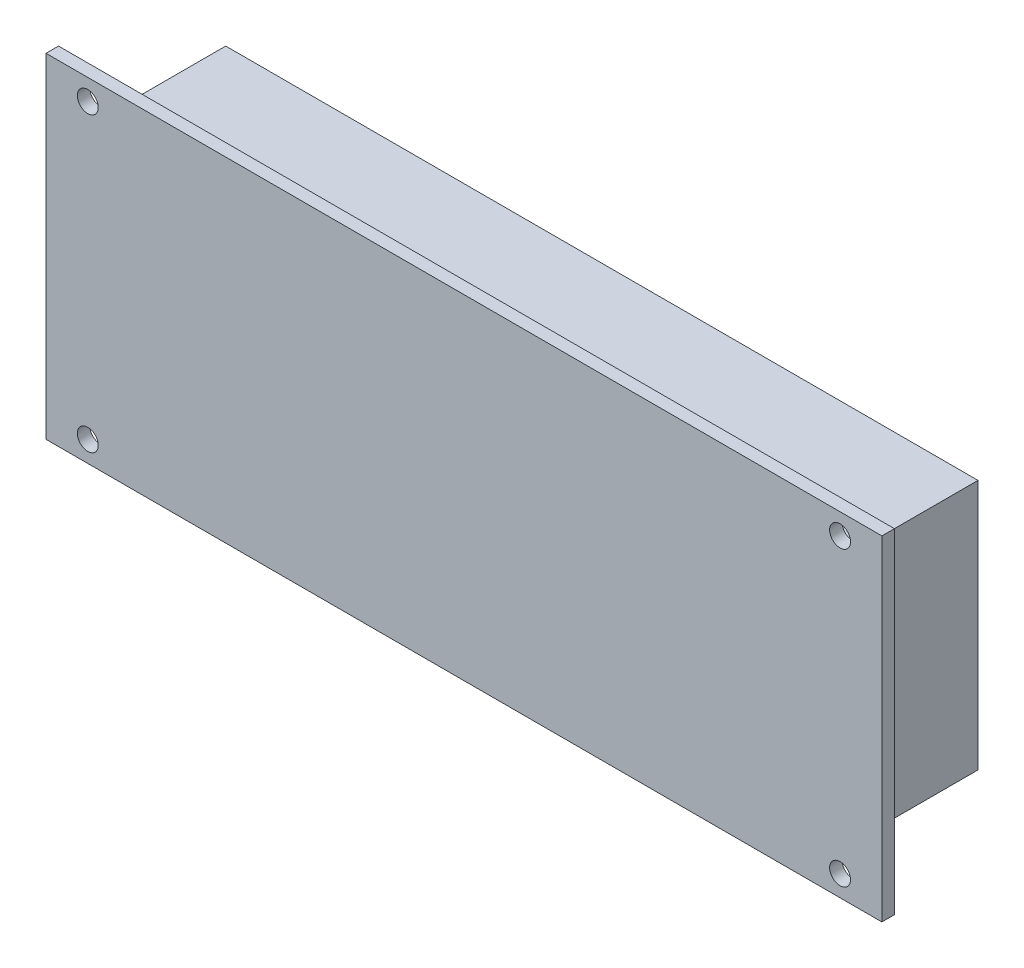
ISO-10303-21;
HEADER;
FILE_DESCRIPTION(('STEP AP214'),'2;1');
FILE_NAME('part.step','',(''),(''),'','','');
FILE_SCHEMA(('AUTOMOTIVE_DESIGN { 1 0 10303 214 1 1 1 1 }'));
ENDSEC;
DATA;
#1=APPLICATION_CONTEXT('core data for automotive mechanical design processes');
#2=APPLICATION_PROTOCOL_DEFINITION('international standard','automotive_design',2000,#1);
#3=PRODUCT_CONTEXT('',#1,'mechanical');
#4=PRODUCT('Part','Part','',(#3));
#5=PRODUCT_RELATED_PRODUCT_CATEGORY('part','',(#4));
#6=PRODUCT_DEFINITION_FORMATION('','',#4);
#7=PRODUCT_DEFINITION_CONTEXT('part definition',#1,'design');
#8=PRODUCT_DEFINITION('design','',#6,#7);
#9=PRODUCT_DEFINITION_SHAPE('','',#8);
#10=(LENGTH_UNIT() NAMED_UNIT(*) SI_UNIT(.MILLI.,.METRE.));
#11=(NAMED_UNIT(*) PLANE_ANGLE_UNIT() SI_UNIT($,.RADIAN.));
#12=(NAMED_UNIT(*) SI_UNIT($,.STERADIAN.) SOLID_ANGLE_UNIT());
#13=UNCERTAINTY_MEASURE_WITH_UNIT(LENGTH_MEASURE(1.E-05),#10,'distance_accuracy_value','');
#14=(GEOMETRIC_REPRESENTATION_CONTEXT(3) GLOBAL_UNCERTAINTY_ASSIGNED_CONTEXT((#13)) GLOBAL_UNIT_ASSIGNED_CONTEXT((#10,
#11,#12)) REPRESENTATION_CONTEXT('',''));
#15=CARTESIAN_POINT('',(0.,0.,0.));
#16=DIRECTION('',(0.,0.,1.));
#17=DIRECTION('',(1.,0.,0.));
#18=AXIS2_PLACEMENT_3D('',#15,#16,#17);
#19=CARTESIAN_POINT('',(100.,-40.,3.));
#20=DIRECTION('',(-1.,0.,0.));
#21=DIRECTION('',(0.,0.,1.));
#22=AXIS2_PLACEMENT_3D('',#19,#20,#21);
#23=PLANE('',#22);
#24=DIRECTION('',(0.,1.,0.));
#25=VECTOR('',#24,1.);
#26=CARTESIAN_POINT('',(100.,-40.,0.));
#27=LINE('',#26,#25);
#28=CARTESIAN_POINT('',(100.,-40.,0.));
#29=VERTEX_POINT('',#28);
#30=CARTESIAN_POINT('',(100.,40.,0.));
#31=VERTEX_POINT('',#30);
#32=EDGE_CURVE('E127',#29,#31,#27,.T.);
#33=ORIENTED_EDGE('',*,*,#32,.T.);
#34=DIRECTION('',(0.,0.,-1.));
#35=VECTOR('',#34,1.);
#36=CARTESIAN_POINT('',(100.,40.,3.));
#37=LINE('',#36,#35);
#38=CARTESIAN_POINT('',(100.,40.,3.));
#39=VERTEX_POINT('',#38);
#40=EDGE_CURVE('E11',#39,#31,#37,.T.);
#41=ORIENTED_EDGE('',*,*,#40,.F.);
#42=DIRECTION('',(0.,1.,0.));
#43=VECTOR('',#42,1.);
#44=CARTESIAN_POINT('',(100.,-40.,3.));
#45=LINE('',#44,#43);
#46=CARTESIAN_POINT('',(100.,-40.,3.));
#47=VERTEX_POINT('',#46);
#48=EDGE_CURVE('E136',#47,#39,#45,.T.);
#49=ORIENTED_EDGE('',*,*,#48,.F.);
#50=DIRECTION('',(0.,0.,-1.));
#51=VECTOR('',#50,1.);
#52=CARTESIAN_POINT('',(100.,-40.,3.));
#53=LINE('',#52,#51);
#54=EDGE_CURVE('E145',#47,#29,#53,.T.);
#55=ORIENTED_EDGE('',*,*,#54,.T.);
#56=EDGE_LOOP('',(#33,#41,#49,#55));
#57=FACE_BOUND('',#56,.T.);
#58=ADVANCED_FACE('F43',(#57),#23,.F.);
#59=CARTESIAN_POINT('',(-100.,40.,3.));
#60=DIRECTION('',(0.,-1.,0.));
#61=DIRECTION('',(0.,0.,-1.));
#62=AXIS2_PLACEMENT_3D('',#59,#60,#61);
#63=PLANE('',#62);
#64=DIRECTION('',(-1.,0.,0.));
#65=VECTOR('',#64,1.);
#66=CARTESIAN_POINT('',(-100.,40.,0.));
#67=LINE('',#66,#65);
#68=CARTESIAN_POINT('',(-100.,40.,0.));
#69=VERTEX_POINT('',#68);
#70=EDGE_CURVE('E130',#31,#69,#67,.T.);
#71=ORIENTED_EDGE('',*,*,#70,.T.);
#72=DIRECTION('',(0.,0.,-1.));
#73=VECTOR('',#72,1.);
#74=CARTESIAN_POINT('',(-100.,40.,3.));
#75=LINE('',#74,#73);
#76=CARTESIAN_POINT('',(-100.,40.,3.));
#77=VERTEX_POINT('',#76);
#78=EDGE_CURVE('E50',#77,#69,#75,.T.);
#79=ORIENTED_EDGE('',*,*,#78,.F.);
#80=DIRECTION('',(-1.,0.,0.));
#81=VECTOR('',#80,1.);
#82=CARTESIAN_POINT('',(-100.,40.,3.));
#83=LINE('',#82,#81);
#84=EDGE_CURVE('E139',#39,#77,#83,.T.);
#85=ORIENTED_EDGE('',*,*,#84,.F.);
#86=ORIENTED_EDGE('',*,*,#40,.T.);
#87=EDGE_LOOP('',(#71,#79,#85,#86));
#88=FACE_BOUND('',#87,.T.);
#89=ADVANCED_FACE('F176',(#88),#63,.F.);
#90=CARTESIAN_POINT('',(-100.,-40.,3.));
#91=DIRECTION('',(1.,0.,0.));
#92=DIRECTION('',(0.,0.,-1.));
#93=AXIS2_PLACEMENT_3D('',#90,#91,#92);
#94=PLANE('',#93);
#95=DIRECTION('',(0.,-1.,0.));
#96=VECTOR('',#95,1.);
#97=CARTESIAN_POINT('',(-100.,-40.,0.));
#98=LINE('',#97,#96);
#99=CARTESIAN_POINT('',(-100.,-40.,0.));
#100=VERTEX_POINT('',#99);
#101=EDGE_CURVE('E148',#69,#100,#98,.T.);
#102=ORIENTED_EDGE('',*,*,#101,.T.);
#103=DIRECTION('',(0.,0.,-1.));
#104=VECTOR('',#103,1.);
#105=CARTESIAN_POINT('',(-100.,-40.,3.));
#106=LINE('',#105,#104);
#107=CARTESIAN_POINT('',(-100.,-40.,3.));
#108=VERTEX_POINT('',#107);
#109=EDGE_CURVE('E153',#108,#100,#106,.T.);
#110=ORIENTED_EDGE('',*,*,#109,.F.);
#111=DIRECTION('',(0.,-1.,0.));
#112=VECTOR('',#111,1.);
#113=CARTESIAN_POINT('',(-100.,-40.,3.));
#114=LINE('',#113,#112);
#115=EDGE_CURVE('E142',#77,#108,#114,.T.);
#116=ORIENTED_EDGE('',*,*,#115,.F.);
#117=ORIENTED_EDGE('',*,*,#78,.T.);
#118=EDGE_LOOP('',(#102,#110,#116,#117));
#119=FACE_BOUND('',#118,.T.);
#120=ADVANCED_FACE('F160',(#119),#94,.F.);
#121=CARTESIAN_POINT('',(-100.,-40.,3.));
#122=DIRECTION('',(0.,1.,0.));
#123=DIRECTION('',(0.,0.,1.));
#124=AXIS2_PLACEMENT_3D('',#121,#122,#123);
#125=PLANE('',#124);
#126=DIRECTION('',(1.,0.,0.));
#127=VECTOR('',#126,1.);
#128=CARTESIAN_POINT('',(-100.,-40.,0.));
#129=LINE('',#128,#127);
#130=EDGE_CURVE('E140',#100,#29,#129,.T.);
#131=ORIENTED_EDGE('',*,*,#130,.T.);
#132=ORIENTED_EDGE('',*,*,#54,.F.);
#133=DIRECTION('',(1.,0.,0.));
#134=VECTOR('',#133,1.);
#135=CARTESIAN_POINT('',(-100.,-40.,3.));
#136=LINE('',#135,#134);
#137=EDGE_CURVE('E144',#108,#47,#136,.T.);
#138=ORIENTED_EDGE('',*,*,#137,.F.);
#139=ORIENTED_EDGE('',*,*,#109,.T.);
#140=EDGE_LOOP('',(#131,#132,#138,#139));
#141=FACE_BOUND('',#140,.T.);
#142=ADVANCED_FACE('F169',(#141),#125,.F.);
#143=CARTESIAN_POINT('',(0.,0.,3.));
#144=DIRECTION('',(0.,0.,-1.));
#145=DIRECTION('',(-1.,0.,0.));
#146=AXIS2_PLACEMENT_3D('',#143,#144,#145);
#147=PLANE('',#146);
#148=CARTESIAN_POINT('',(90.,35.,3.));
#149=DIRECTION('',(0.,0.,-1.));
#150=DIRECTION('',(-1.,0.,0.));
#151=AXIS2_PLACEMENT_3D('',#148,#149,#150);
#152=CIRCLE('',#151,2.49999999999999);
#153=CARTESIAN_POINT('',(87.5,35.,3.));
#154=VERTEX_POINT('',#153);
#155=EDGE_CURVE('E229',#154,#154,#152,.T.);
#156=ORIENTED_EDGE('',*,*,#155,.T.);
#157=EDGE_LOOP('',(#156));
#158=FACE_BOUND('',#157,.T.);
#159=CARTESIAN_POINT('',(89.9999999999998,-35.,3.));
#160=DIRECTION('',(0.,0.,-1.));
#161=DIRECTION('',(-1.,0.,0.));
#162=AXIS2_PLACEMENT_3D('',#159,#160,#161);
#163=CIRCLE('',#162,2.49999999999999);
#164=CARTESIAN_POINT('',(87.4999999999998,-35.,3.));
#165=VERTEX_POINT('',#164);
#166=EDGE_CURVE('E233',#165,#165,#163,.T.);
#167=ORIENTED_EDGE('',*,*,#166,.T.);
#168=EDGE_LOOP('',(#167));
#169=FACE_BOUND('',#168,.T.);
#170=CARTESIAN_POINT('',(-89.9999999999991,-35.0000000000009,3.));
#171=DIRECTION('',(0.,0.,-1.));
#172=DIRECTION('',(-1.,0.,0.));
#173=AXIS2_PLACEMENT_3D('',#170,#171,#172);
#174=CIRCLE('',#173,2.49999999999999);
#175=CARTESIAN_POINT('',(-92.4999999999991,-35.0000000000009,3.));
#176=VERTEX_POINT('',#175);
#177=EDGE_CURVE('E242',#176,#176,#174,.T.);
#178=ORIENTED_EDGE('',*,*,#177,.T.);
#179=EDGE_LOOP('',(#178));
#180=FACE_BOUND('',#179,.T.);
#181=CARTESIAN_POINT('',(-90.,34.9999999999991,3.));
#182=DIRECTION('',(0.,0.,-1.));
#183=DIRECTION('',(-1.,0.,0.));
#184=AXIS2_PLACEMENT_3D('',#181,#182,#183);
#185=CIRCLE('',#184,2.49999999999999);
#186=CARTESIAN_POINT('',(-92.5,34.9999999999991,3.));
#187=VERTEX_POINT('',#186);
#188=EDGE_CURVE('E248',#187,#187,#185,.T.);
#189=ORIENTED_EDGE('',*,*,#188,.T.);
#190=EDGE_LOOP('',(#189));
#191=FACE_BOUND('',#190,.T.);
#192=ORIENTED_EDGE('',*,*,#48,.T.);
#193=ORIENTED_EDGE('',*,*,#84,.T.);
#194=ORIENTED_EDGE('',*,*,#115,.T.);
#195=ORIENTED_EDGE('',*,*,#137,.T.);
#196=EDGE_LOOP('',(#192,#193,#194,#195));
#197=FACE_BOUND('',#196,.T.);
#198=ADVANCED_FACE('F175',(#158,#169,#180,#191,#197),#147,.F.);
#199=CARTESIAN_POINT('',(0.,0.,0.));
#200=DIRECTION('',(0.,0.,-1.));
#201=DIRECTION('',(-1.,0.,0.));
#202=AXIS2_PLACEMENT_3D('',#199,#200,#201);
#203=PLANE('',#202);
#204=CARTESIAN_POINT('',(90.,35.,0.));
#205=DIRECTION('',(0.,0.,-1.));
#206=DIRECTION('',(-1.,0.,0.));
#207=AXIS2_PLACEMENT_3D('',#204,#205,#206);
#208=CIRCLE('',#207,2.49999999999999);
#209=CARTESIAN_POINT('',(87.5,35.,0.));
#210=VERTEX_POINT('',#209);
#211=EDGE_CURVE('E226',#210,#210,#208,.T.);
#212=ORIENTED_EDGE('',*,*,#211,.F.);
#213=EDGE_LOOP('',(#212));
#214=FACE_BOUND('',#213,.T.);
#215=CARTESIAN_POINT('',(89.9999999999998,-35.,0.));
#216=DIRECTION('',(0.,0.,-1.));
#217=DIRECTION('',(-1.,0.,0.));
#218=AXIS2_PLACEMENT_3D('',#215,#216,#217);
#219=CIRCLE('',#218,2.49999999999999);
#220=CARTESIAN_POINT('',(87.4999999999998,-35.,0.));
#221=VERTEX_POINT('',#220);
#222=EDGE_CURVE('E230',#221,#221,#219,.T.);
#223=ORIENTED_EDGE('',*,*,#222,.F.);
#224=EDGE_LOOP('',(#223));
#225=FACE_BOUND('',#224,.T.);
#226=CARTESIAN_POINT('',(-89.9999999999991,-35.0000000000009,0.));
#227=DIRECTION('',(0.,0.,-1.));
#228=DIRECTION('',(-1.,0.,0.));
#229=AXIS2_PLACEMENT_3D('',#226,#227,#228);
#230=CIRCLE('',#229,2.49999999999999);
#231=CARTESIAN_POINT('',(-92.4999999999991,-35.0000000000009,0.));
#232=VERTEX_POINT('',#231);
#233=EDGE_CURVE('E239',#232,#232,#230,.T.);
#234=ORIENTED_EDGE('',*,*,#233,.F.);
#235=EDGE_LOOP('',(#234));
#236=FACE_BOUND('',#235,.T.);
#237=CARTESIAN_POINT('',(-90.,34.9999999999991,0.));
#238=DIRECTION('',(0.,0.,-1.));
#239=DIRECTION('',(-1.,0.,0.));
#240=AXIS2_PLACEMENT_3D('',#237,#238,#239);
#241=CIRCLE('',#240,2.49999999999999);
#242=CARTESIAN_POINT('',(-92.5,34.9999999999991,0.));
#243=VERTEX_POINT('',#242);
#244=EDGE_CURVE('E245',#243,#243,#241,.T.);
#245=ORIENTED_EDGE('',*,*,#244,.F.);
#246=EDGE_LOOP('',(#245));
#247=FACE_BOUND('',#246,.T.);
#248=DIRECTION('',(0.,1.,0.));
#249=VECTOR('',#248,1.);
#250=CARTESIAN_POINT('',(-90.,-30.,0.));
#251=LINE('',#250,#249);
#252=CARTESIAN_POINT('',(-90.,-30.,0.));
#253=VERTEX_POINT('',#252);
#254=CARTESIAN_POINT('',(-90.,30.,0.));
#255=VERTEX_POINT('',#254);
#256=EDGE_CURVE('E57',#253,#255,#251,.T.);
#257=ORIENTED_EDGE('',*,*,#256,.F.);
#258=DIRECTION('',(-1.,0.,0.));
#259=VECTOR('',#258,1.);
#260=CARTESIAN_POINT('',(90.,-30.,0.));
#261=LINE('',#260,#259);
#262=CARTESIAN_POINT('',(90.,-30.,0.));
#263=VERTEX_POINT('',#262);
#264=EDGE_CURVE('E61',#263,#253,#261,.T.);
#265=ORIENTED_EDGE('',*,*,#264,.F.);
#266=DIRECTION('',(0.,-1.,0.));
#267=VECTOR('',#266,1.);
#268=CARTESIAN_POINT('',(90.,-30.,0.));
#269=LINE('',#268,#267);
#270=CARTESIAN_POINT('',(90.,30.,0.));
#271=VERTEX_POINT('',#270);
#272=EDGE_CURVE('E257',#271,#263,#269,.T.);
#273=ORIENTED_EDGE('',*,*,#272,.F.);
#274=DIRECTION('',(1.,0.,0.));
#275=VECTOR('',#274,1.);
#276=CARTESIAN_POINT('',(90.,30.,0.));
#277=LINE('',#276,#275);
#278=EDGE_CURVE('E255',#255,#271,#277,.T.);
#279=ORIENTED_EDGE('',*,*,#278,.F.);
#280=EDGE_LOOP('',(#257,#265,#273,#279));
#281=FACE_BOUND('',#280,.T.);
#282=ORIENTED_EDGE('',*,*,#32,.F.);
#283=ORIENTED_EDGE('',*,*,#130,.F.);
#284=ORIENTED_EDGE('',*,*,#101,.F.);
#285=ORIENTED_EDGE('',*,*,#70,.F.);
#286=EDGE_LOOP('',(#282,#283,#284,#285));
#287=FACE_BOUND('',#286,.T.);
#288=ADVANCED_FACE('F166',(#214,#225,#236,#247,#281,#287),#203,.T.);
#289=CARTESIAN_POINT('',(-90.,-30.,-30.));
#290=DIRECTION('',(1.,0.,0.));
#291=DIRECTION('',(0.,0.,-1.));
#292=AXIS2_PLACEMENT_3D('',#289,#290,#291);
#293=PLANE('',#292);
#294=ORIENTED_EDGE('',*,*,#256,.T.);
#295=DIRECTION('',(0.,0.,1.));
#296=VECTOR('',#295,1.);
#297=CARTESIAN_POINT('',(-90.,30.,-30.));
#298=LINE('',#297,#296);
#299=CARTESIAN_POINT('',(-90.,30.,-30.));
#300=VERTEX_POINT('',#299);
#301=EDGE_CURVE('E110',#300,#255,#298,.T.);
#302=ORIENTED_EDGE('',*,*,#301,.F.);
#303=DIRECTION('',(0.,1.,0.));
#304=VECTOR('',#303,1.);
#305=CARTESIAN_POINT('',(-90.,-30.,-30.));
#306=LINE('',#305,#304);
#307=CARTESIAN_POINT('',(-90.,-30.,-30.));
#308=VERTEX_POINT('',#307);
#309=EDGE_CURVE('E116',#308,#300,#306,.T.);
#310=ORIENTED_EDGE('',*,*,#309,.F.);
#311=DIRECTION('',(0.,0.,1.));
#312=VECTOR('',#311,1.);
#313=CARTESIAN_POINT('',(-90.,-30.,-30.));
#314=LINE('',#313,#312);
#315=EDGE_CURVE('E253',#308,#253,#314,.T.);
#316=ORIENTED_EDGE('',*,*,#315,.T.);
#317=EDGE_LOOP('',(#294,#302,#310,#316));
#318=FACE_BOUND('',#317,.T.);
#319=ADVANCED_FACE('F126',(#318),#293,.F.);
#320=CARTESIAN_POINT('',(90.,30.,-30.));
#321=DIRECTION('',(0.,-1.,0.));
#322=DIRECTION('',(0.,0.,-1.));
#323=AXIS2_PLACEMENT_3D('',#320,#321,#322);
#324=PLANE('',#323);
#325=ORIENTED_EDGE('',*,*,#278,.T.);
#326=DIRECTION('',(0.,0.,1.));
#327=VECTOR('',#326,1.);
#328=CARTESIAN_POINT('',(90.,30.,-30.));
#329=LINE('',#328,#327);
#330=CARTESIAN_POINT('',(90.,30.,-30.));
#331=VERTEX_POINT('',#330);
#332=EDGE_CURVE('E112',#331,#271,#329,.T.);
#333=ORIENTED_EDGE('',*,*,#332,.F.);
#334=DIRECTION('',(1.,0.,0.));
#335=VECTOR('',#334,1.);
#336=CARTESIAN_POINT('',(90.,30.,-30.));
#337=LINE('',#336,#335);
#338=EDGE_CURVE('E105',#300,#331,#337,.T.);
#339=ORIENTED_EDGE('',*,*,#338,.F.);
#340=ORIENTED_EDGE('',*,*,#301,.T.);
#341=EDGE_LOOP('',(#325,#333,#339,#340));
#342=FACE_BOUND('',#341,.T.);
#343=ADVANCED_FACE('F108',(#342),#324,.F.);
#344=CARTESIAN_POINT('',(90.,-30.,-30.));
#345=DIRECTION('',(-1.,0.,0.));
#346=DIRECTION('',(0.,0.,1.));
#347=AXIS2_PLACEMENT_3D('',#344,#345,#346);
#348=PLANE('',#347);
#349=ORIENTED_EDGE('',*,*,#272,.T.);
#350=DIRECTION('',(0.,0.,1.));
#351=VECTOR('',#350,1.);
#352=CARTESIAN_POINT('',(90.,-30.,-30.));
#353=LINE('',#352,#351);
#354=CARTESIAN_POINT('',(90.,-30.,-30.));
#355=VERTEX_POINT('',#354);
#356=EDGE_CURVE('E132',#355,#263,#353,.T.);
#357=ORIENTED_EDGE('',*,*,#356,.F.);
#358=DIRECTION('',(0.,-1.,0.));
#359=VECTOR('',#358,1.);
#360=CARTESIAN_POINT('',(90.,-30.,-30.));
#361=LINE('',#360,#359);
#362=EDGE_CURVE('E115',#331,#355,#361,.T.);
#363=ORIENTED_EDGE('',*,*,#362,.F.);
#364=ORIENTED_EDGE('',*,*,#332,.T.);
#365=EDGE_LOOP('',(#349,#357,#363,#364));
#366=FACE_BOUND('',#365,.T.);
#367=ADVANCED_FACE('F196',(#366),#348,.F.);
#368=CARTESIAN_POINT('',(90.,-30.,-30.));
#369=DIRECTION('',(0.,1.,0.));
#370=DIRECTION('',(0.,0.,1.));
#371=AXIS2_PLACEMENT_3D('',#368,#369,#370);
#372=PLANE('',#371);
#373=ORIENTED_EDGE('',*,*,#264,.T.);
#374=ORIENTED_EDGE('',*,*,#315,.F.);
#375=DIRECTION('',(-1.,0.,0.));
#376=VECTOR('',#375,1.);
#377=CARTESIAN_POINT('',(90.,-30.,-30.));
#378=LINE('',#377,#376);
#379=EDGE_CURVE('E121',#355,#308,#378,.T.);
#380=ORIENTED_EDGE('',*,*,#379,.F.);
#381=ORIENTED_EDGE('',*,*,#356,.T.);
#382=EDGE_LOOP('',(#373,#374,#380,#381));
#383=FACE_BOUND('',#382,.T.);
#384=ADVANCED_FACE('F199',(#383),#372,.F.);
#385=CARTESIAN_POINT('',(0.,0.,-30.));
#386=DIRECTION('',(0.,0.,1.));
#387=DIRECTION('',(1.,0.,0.));
#388=AXIS2_PLACEMENT_3D('',#385,#386,#387);
#389=PLANE('',#388);
#390=ORIENTED_EDGE('',*,*,#309,.T.);
#391=ORIENTED_EDGE('',*,*,#338,.T.);
#392=ORIENTED_EDGE('',*,*,#362,.T.);
#393=ORIENTED_EDGE('',*,*,#379,.T.);
#394=EDGE_LOOP('',(#390,#391,#392,#393));
#395=FACE_BOUND('',#394,.T.);
#396=ADVANCED_FACE('F119',(#395),#389,.F.);
#397=CARTESIAN_POINT('',(-90.,34.9999999999991,0.));
#398=DIRECTION('',(0.,0.,-1.));
#399=DIRECTION('',(-1.,0.,0.));
#400=AXIS2_PLACEMENT_3D('',#397,#398,#399);
#401=CYLINDRICAL_SURFACE('',#400,2.49999999999999);
#402=ORIENTED_EDGE('',*,*,#244,.T.);
#403=EDGE_LOOP('',(#402));
#404=FACE_BOUND('',#403,.T.);
#405=ORIENTED_EDGE('',*,*,#188,.F.);
#406=EDGE_LOOP('',(#405));
#407=FACE_BOUND('',#406,.T.);
#408=ADVANCED_FACE('F206',(#404,#407),#401,.F.);
#409=CARTESIAN_POINT('',(-89.9999999999991,-35.0000000000009,0.));
#410=DIRECTION('',(0.,0.,-1.));
#411=DIRECTION('',(-1.,0.,0.));
#412=AXIS2_PLACEMENT_3D('',#409,#410,#411);
#413=CYLINDRICAL_SURFACE('',#412,2.49999999999999);
#414=ORIENTED_EDGE('',*,*,#233,.T.);
#415=EDGE_LOOP('',(#414));
#416=FACE_BOUND('',#415,.T.);
#417=ORIENTED_EDGE('',*,*,#177,.F.);
#418=EDGE_LOOP('',(#417));
#419=FACE_BOUND('',#418,.T.);
#420=ADVANCED_FACE('F209',(#416,#419),#413,.F.);
#421=CARTESIAN_POINT('',(89.9999999999998,-35.,0.));
#422=DIRECTION('',(0.,0.,-1.));
#423=DIRECTION('',(-1.,0.,0.));
#424=AXIS2_PLACEMENT_3D('',#421,#422,#423);
#425=CYLINDRICAL_SURFACE('',#424,2.49999999999999);
#426=ORIENTED_EDGE('',*,*,#222,.T.);
#427=EDGE_LOOP('',(#426));
#428=FACE_BOUND('',#427,.T.);
#429=ORIENTED_EDGE('',*,*,#166,.F.);
#430=EDGE_LOOP('',(#429));
#431=FACE_BOUND('',#430,.T.);
#432=ADVANCED_FACE('F213',(#428,#431),#425,.F.);
#433=CARTESIAN_POINT('',(90.,35.,0.));
#434=DIRECTION('',(0.,0.,-1.));
#435=DIRECTION('',(-1.,0.,0.));
#436=AXIS2_PLACEMENT_3D('',#433,#434,#435);
#437=CYLINDRICAL_SURFACE('',#436,2.49999999999999);
#438=ORIENTED_EDGE('',*,*,#211,.T.);
#439=EDGE_LOOP('',(#438));
#440=FACE_BOUND('',#439,.T.);
#441=ORIENTED_EDGE('',*,*,#155,.F.);
#442=EDGE_LOOP('',(#441));
#443=FACE_BOUND('',#442,.T.);
#444=ADVANCED_FACE('F217',(#440,#443),#437,.F.);
#445=CLOSED_SHELL('',(#58,#89,#120,#142,#198,#288,#319,#343,#367,#384,#396,#408,#420,#432,#444));
#446=MANIFOLD_SOLID_BREP('B2',#445);
#447=ADVANCED_BREP_SHAPE_REPRESENTATION('',(#18,#446),#14);
#448=SHAPE_DEFINITION_REPRESENTATION(#9,#447);
ENDSEC;
END-ISO-10303-21;
